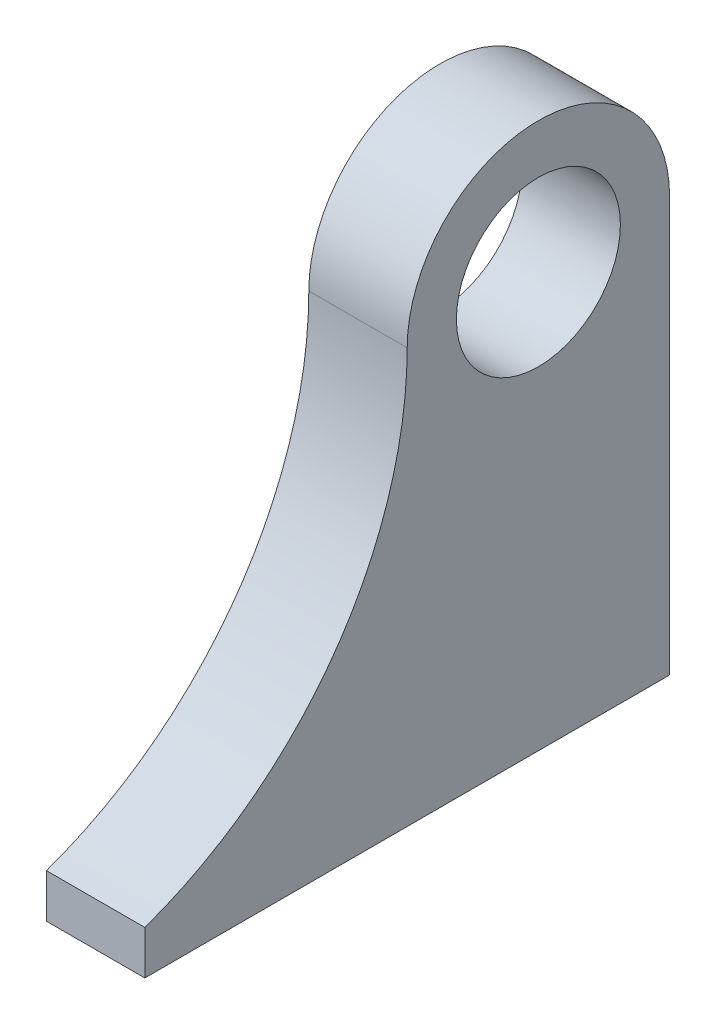
ISO-10303-21;
HEADER;
FILE_DESCRIPTION(('STEP AP214'),'2;1');
FILE_NAME('part.step','',(''),(''),'','','');
FILE_SCHEMA(('AUTOMOTIVE_DESIGN { 1 0 10303 214 1 1 1 1 }'));
ENDSEC;
DATA;
#1=APPLICATION_CONTEXT('core data for automotive mechanical design processes');
#2=APPLICATION_PROTOCOL_DEFINITION('international standard','automotive_design',2000,#1);
#3=PRODUCT_CONTEXT('',#1,'mechanical');
#4=PRODUCT('Part','Part','',(#3));
#5=PRODUCT_RELATED_PRODUCT_CATEGORY('part','',(#4));
#6=PRODUCT_DEFINITION_FORMATION('','',#4);
#7=PRODUCT_DEFINITION_CONTEXT('part definition',#1,'design');
#8=PRODUCT_DEFINITION('design','',#6,#7);
#9=PRODUCT_DEFINITION_SHAPE('','',#8);
#10=(LENGTH_UNIT() NAMED_UNIT(*) SI_UNIT(.MILLI.,.METRE.));
#11=(NAMED_UNIT(*) PLANE_ANGLE_UNIT() SI_UNIT($,.RADIAN.));
#12=(NAMED_UNIT(*) SI_UNIT($,.STERADIAN.) SOLID_ANGLE_UNIT());
#13=UNCERTAINTY_MEASURE_WITH_UNIT(LENGTH_MEASURE(1.E-05),#10,'distance_accuracy_value','');
#14=(GEOMETRIC_REPRESENTATION_CONTEXT(3) GLOBAL_UNCERTAINTY_ASSIGNED_CONTEXT((#13)) GLOBAL_UNIT_ASSIGNED_CONTEXT((#10,
#11,#12)) REPRESENTATION_CONTEXT('',''));
#15=CARTESIAN_POINT('',(0.,0.,0.));
#16=DIRECTION('',(0.,0.,1.));
#17=DIRECTION('',(1.,0.,0.));
#18=AXIS2_PLACEMENT_3D('',#15,#16,#17);
#19=CARTESIAN_POINT('',(602.191666666667,26.416,-454.152));
#20=DIRECTION('',(1.,0.,0.));
#21=DIRECTION('',(0.,0.,-1.));
#22=AXIS2_PLACEMENT_3D('',#19,#20,#21);
#23=PLANE('',#22);
#24=CARTESIAN_POINT('',(602.191666666667,20.066,-432.985333333333));
#25=DIRECTION('',(1.,0.,0.));
#26=DIRECTION('',(0.,0.,-1.));
#27=AXIS2_PLACEMENT_3D('',#24,#25,#26);
#28=CIRCLE('',#27,3.96875000000005);
#29=CARTESIAN_POINT('',(602.191666666667,20.066,-436.954083333333));
#30=VERTEX_POINT('',#29);
#31=EDGE_CURVE('E155',#30,#30,#28,.T.);
#32=ORIENTED_EDGE('',*,*,#31,.T.);
#33=EDGE_LOOP('',(#32));
#34=FACE_BOUND('',#33,.T.);
#35=CARTESIAN_POINT('',(602.191666666667,20.066,-432.985333333333));
#36=DIRECTION('',(1.,0.,0.));
#37=DIRECTION('',(0.,0.,-1.));
#38=AXIS2_PLACEMENT_3D('',#35,#36,#37);
#39=CIRCLE('',#38,6.35000000000002);
#40=CARTESIAN_POINT('',(602.191666666667,20.066,-439.335333333333));
#41=VERTEX_POINT('',#40);
#42=CARTESIAN_POINT('',(602.191666666667,20.066,-426.635333333333));
#43=VERTEX_POINT('',#42);
#44=EDGE_CURVE('E102',#41,#43,#39,.T.);
#45=ORIENTED_EDGE('',*,*,#44,.F.);
#46=DIRECTION('',(0.,-1.,0.));
#47=VECTOR('',#46,1.);
#48=CARTESIAN_POINT('',(602.191666666667,26.416,-439.335333333333));
#49=LINE('',#48,#47);
#50=CARTESIAN_POINT('',(602.191666666667,0.,-439.335333333333));
#51=VERTEX_POINT('',#50);
#52=EDGE_CURVE('E142',#41,#51,#49,.T.);
#53=ORIENTED_EDGE('',*,*,#52,.T.);
#54=DIRECTION('',(0.,0.,1.));
#55=VECTOR('',#54,1.);
#56=CARTESIAN_POINT('',(602.191666666667,0.,-454.152));
#57=LINE('',#56,#55);
#58=CARTESIAN_POINT('',(602.191666666667,0.,-413.935333333333));
#59=VERTEX_POINT('',#58);
#60=EDGE_CURVE('E94',#51,#59,#57,.T.);
#61=ORIENTED_EDGE('',*,*,#60,.T.);
#62=DIRECTION('',(0.,1.,0.));
#63=VECTOR('',#62,1.);
#64=CARTESIAN_POINT('',(602.191666666667,26.416,-413.935333333333));
#65=LINE('',#64,#63);
#66=CARTESIAN_POINT('',(602.191666666667,2.12,-413.935333333333));
#67=VERTEX_POINT('',#66);
#68=EDGE_CURVE('E163',#59,#67,#65,.T.);
#69=ORIENTED_EDGE('',*,*,#68,.T.);
#70=CARTESIAN_POINT('',(602.191666666667,20.0660000000002,-407.605848451443));
#71=DIRECTION('',(1.,0.,0.));
#72=DIRECTION('',(0.,0.,-1.));
#73=AXIS2_PLACEMENT_3D('',#70,#71,#72);
#74=CIRCLE('',#73,19.0294848818902);
#75=EDGE_CURVE('E167',#67,#43,#74,.T.);
#76=ORIENTED_EDGE('',*,*,#75,.T.);
#77=EDGE_LOOP('',(#45,#53,#61,#69,#76));
#78=FACE_BOUND('',#77,.T.);
#79=ADVANCED_FACE('F80',(#34,#78),#23,.F.);
#80=CARTESIAN_POINT('',(606.954166666667,26.416,-454.152));
#81=DIRECTION('',(-1.,0.,0.));
#82=DIRECTION('',(0.,0.,1.));
#83=AXIS2_PLACEMENT_3D('',#80,#81,#82);
#84=PLANE('',#83);
#85=CARTESIAN_POINT('',(606.954166666667,20.066,-432.985333333333));
#86=DIRECTION('',(1.,0.,0.));
#87=DIRECTION('',(0.,0.,-1.));
#88=AXIS2_PLACEMENT_3D('',#85,#86,#87);
#89=CIRCLE('',#88,3.96875000000005);
#90=CARTESIAN_POINT('',(606.954166666667,20.066,-436.954083333333));
#91=VERTEX_POINT('',#90);
#92=EDGE_CURVE('E149',#91,#91,#89,.T.);
#93=ORIENTED_EDGE('',*,*,#92,.F.);
#94=EDGE_LOOP('',(#93));
#95=FACE_BOUND('',#94,.T.);
#96=DIRECTION('',(0.,-1.,0.));
#97=VECTOR('',#96,1.);
#98=CARTESIAN_POINT('',(606.954166666667,0.,-439.335333333333));
#99=LINE('',#98,#97);
#100=CARTESIAN_POINT('',(606.954166666667,20.066,-439.335333333333));
#101=VERTEX_POINT('',#100);
#102=CARTESIAN_POINT('',(606.954166666667,0.,-439.335333333333));
#103=VERTEX_POINT('',#102);
#104=EDGE_CURVE('E140',#101,#103,#99,.T.);
#105=ORIENTED_EDGE('',*,*,#104,.F.);
#106=CARTESIAN_POINT('',(606.954166666667,20.066,-432.985333333333));
#107=DIRECTION('',(1.,0.,0.));
#108=DIRECTION('',(0.,0.,-1.));
#109=AXIS2_PLACEMENT_3D('',#106,#107,#108);
#110=CIRCLE('',#109,6.35000000000002);
#111=CARTESIAN_POINT('',(606.954166666667,20.066,-426.635333333333));
#112=VERTEX_POINT('',#111);
#113=EDGE_CURVE('E125',#101,#112,#110,.T.);
#114=ORIENTED_EDGE('',*,*,#113,.T.);
#115=CARTESIAN_POINT('',(606.954166666667,20.0660000000002,-407.605848451443));
#116=DIRECTION('',(1.,0.,0.));
#117=DIRECTION('',(0.,0.,-1.));
#118=AXIS2_PLACEMENT_3D('',#115,#116,#117);
#119=CIRCLE('',#118,19.0294848818902);
#120=CARTESIAN_POINT('',(606.954166666667,2.12,-413.935333333333));
#121=VERTEX_POINT('',#120);
#122=EDGE_CURVE('E135',#121,#112,#119,.T.);
#123=ORIENTED_EDGE('',*,*,#122,.F.);
#124=DIRECTION('',(0.,1.,0.));
#125=VECTOR('',#124,1.);
#126=CARTESIAN_POINT('',(606.954166666667,0.,-413.935333333333));
#127=LINE('',#126,#125);
#128=CARTESIAN_POINT('',(606.954166666667,0.,-413.935333333333));
#129=VERTEX_POINT('',#128);
#130=EDGE_CURVE('E158',#129,#121,#127,.T.);
#131=ORIENTED_EDGE('',*,*,#130,.F.);
#132=DIRECTION('',(0.,0.,-1.));
#133=VECTOR('',#132,1.);
#134=CARTESIAN_POINT('',(606.954166666667,0.,-454.152));
#135=LINE('',#134,#133);
#136=EDGE_CURVE('E148',#129,#103,#135,.T.);
#137=ORIENTED_EDGE('',*,*,#136,.T.);
#138=EDGE_LOOP('',(#105,#114,#123,#131,#137));
#139=FACE_BOUND('',#138,.T.);
#140=ADVANCED_FACE('F145',(#95,#139),#84,.F.);
#141=CARTESIAN_POINT('',(0.,0.,0.));
#142=DIRECTION('',(0.,-1.,0.));
#143=DIRECTION('',(0.,0.,-1.));
#144=AXIS2_PLACEMENT_3D('',#141,#142,#143);
#145=PLANE('',#144);
#146=DIRECTION('',(-1.,0.,0.));
#147=VECTOR('',#146,1.);
#148=CARTESIAN_POINT('',(0.,0.,-439.335333333333));
#149=LINE('',#148,#147);
#150=EDGE_CURVE('E12',#103,#51,#149,.T.);
#151=ORIENTED_EDGE('',*,*,#150,.F.);
#152=ORIENTED_EDGE('',*,*,#136,.F.);
#153=DIRECTION('',(1.,0.,0.));
#154=VECTOR('',#153,1.);
#155=CARTESIAN_POINT('',(0.,0.,-413.935333333333));
#156=LINE('',#155,#154);
#157=EDGE_CURVE('E87',#59,#129,#156,.T.);
#158=ORIENTED_EDGE('',*,*,#157,.F.);
#159=ORIENTED_EDGE('',*,*,#60,.F.);
#160=EDGE_LOOP('',(#151,#152,#158,#159));
#161=FACE_BOUND('',#160,.T.);
#162=ADVANCED_FACE('F176',(#161),#145,.T.);
#163=CARTESIAN_POINT('',(581.554166666667,20.0660000000002,-407.605848451443));
#164=DIRECTION('',(1.,0.,0.));
#165=DIRECTION('',(0.,0.,-1.));
#166=AXIS2_PLACEMENT_3D('',#163,#164,#165);
#167=CYLINDRICAL_SURFACE('',#166,19.0294848818902);
#168=DIRECTION('',(1.,0.,0.));
#169=VECTOR('',#168,1.);
#170=CARTESIAN_POINT('',(581.554166666667,2.12,-413.935333333333));
#171=LINE('',#170,#169);
#172=EDGE_CURVE('E134',#67,#121,#171,.T.);
#173=ORIENTED_EDGE('',*,*,#172,.T.);
#174=ORIENTED_EDGE('',*,*,#122,.T.);
#175=DIRECTION('',(1.,0.,0.));
#176=VECTOR('',#175,1.);
#177=CARTESIAN_POINT('',(581.554166666667,20.066,-426.635333333333));
#178=LINE('',#177,#176);
#179=EDGE_CURVE('E129',#43,#112,#178,.T.);
#180=ORIENTED_EDGE('',*,*,#179,.F.);
#181=ORIENTED_EDGE('',*,*,#75,.F.);
#182=EDGE_LOOP('',(#173,#174,#180,#181));
#183=FACE_BOUND('',#182,.T.);
#184=ADVANCED_FACE('F178',(#183),#167,.F.);
#185=CARTESIAN_POINT('',(581.554166666667,20.066,-432.985333333333));
#186=DIRECTION('',(1.,0.,0.));
#187=DIRECTION('',(0.,0.,-1.));
#188=AXIS2_PLACEMENT_3D('',#185,#186,#187);
#189=CYLINDRICAL_SURFACE('',#188,6.35000000000002);
#190=ORIENTED_EDGE('',*,*,#44,.T.);
#191=ORIENTED_EDGE('',*,*,#179,.T.);
#192=ORIENTED_EDGE('',*,*,#113,.F.);
#193=DIRECTION('',(1.,0.,0.));
#194=VECTOR('',#193,1.);
#195=CARTESIAN_POINT('',(581.554166666667,20.066,-439.335333333333));
#196=LINE('',#195,#194);
#197=EDGE_CURVE('E128',#41,#101,#196,.T.);
#198=ORIENTED_EDGE('',*,*,#197,.F.);
#199=EDGE_LOOP('',(#190,#191,#192,#198));
#200=FACE_BOUND('',#199,.T.);
#201=ADVANCED_FACE('F127',(#200),#189,.T.);
#202=CARTESIAN_POINT('',(581.554166666667,0.,-413.935333333333));
#203=DIRECTION('',(0.,0.,-1.));
#204=DIRECTION('',(-1.,0.,0.));
#205=AXIS2_PLACEMENT_3D('',#202,#203,#204);
#206=PLANE('',#205);
#207=ORIENTED_EDGE('',*,*,#157,.T.);
#208=ORIENTED_EDGE('',*,*,#130,.T.);
#209=ORIENTED_EDGE('',*,*,#172,.F.);
#210=ORIENTED_EDGE('',*,*,#68,.F.);
#211=EDGE_LOOP('',(#207,#208,#209,#210));
#212=FACE_BOUND('',#211,.T.);
#213=ADVANCED_FACE('F173',(#212),#206,.F.);
#214=CARTESIAN_POINT('',(581.554166666667,0.,-439.335333333333));
#215=DIRECTION('',(0.,0.,1.));
#216=DIRECTION('',(1.,0.,0.));
#217=AXIS2_PLACEMENT_3D('',#214,#215,#216);
#218=PLANE('',#217);
#219=ORIENTED_EDGE('',*,*,#197,.T.);
#220=ORIENTED_EDGE('',*,*,#104,.T.);
#221=ORIENTED_EDGE('',*,*,#150,.T.);
#222=ORIENTED_EDGE('',*,*,#52,.F.);
#223=EDGE_LOOP('',(#219,#220,#221,#222));
#224=FACE_BOUND('',#223,.T.);
#225=ADVANCED_FACE('F139',(#224),#218,.F.);
#226=CARTESIAN_POINT('',(581.554166666667,20.066,-432.985333333333));
#227=DIRECTION('',(1.,0.,0.));
#228=DIRECTION('',(0.,0.,-1.));
#229=AXIS2_PLACEMENT_3D('',#226,#227,#228);
#230=CYLINDRICAL_SURFACE('',#229,3.96875000000005);
#231=ORIENTED_EDGE('',*,*,#92,.T.);
#232=EDGE_LOOP('',(#231));
#233=FACE_BOUND('',#232,.T.);
#234=ORIENTED_EDGE('',*,*,#31,.F.);
#235=EDGE_LOOP('',(#234));
#236=FACE_BOUND('',#235,.T.);
#237=ADVANCED_FACE('F196',(#233,#236),#230,.F.);
#238=CLOSED_SHELL('',(#79,#140,#162,#184,#201,#213,#225,#237));
#239=MANIFOLD_SOLID_BREP('B2',#238);
#240=ADVANCED_BREP_SHAPE_REPRESENTATION('',(#18,#239),#14);
#241=SHAPE_DEFINITION_REPRESENTATION(#9,#240);
ENDSEC;
END-ISO-10303-21;
